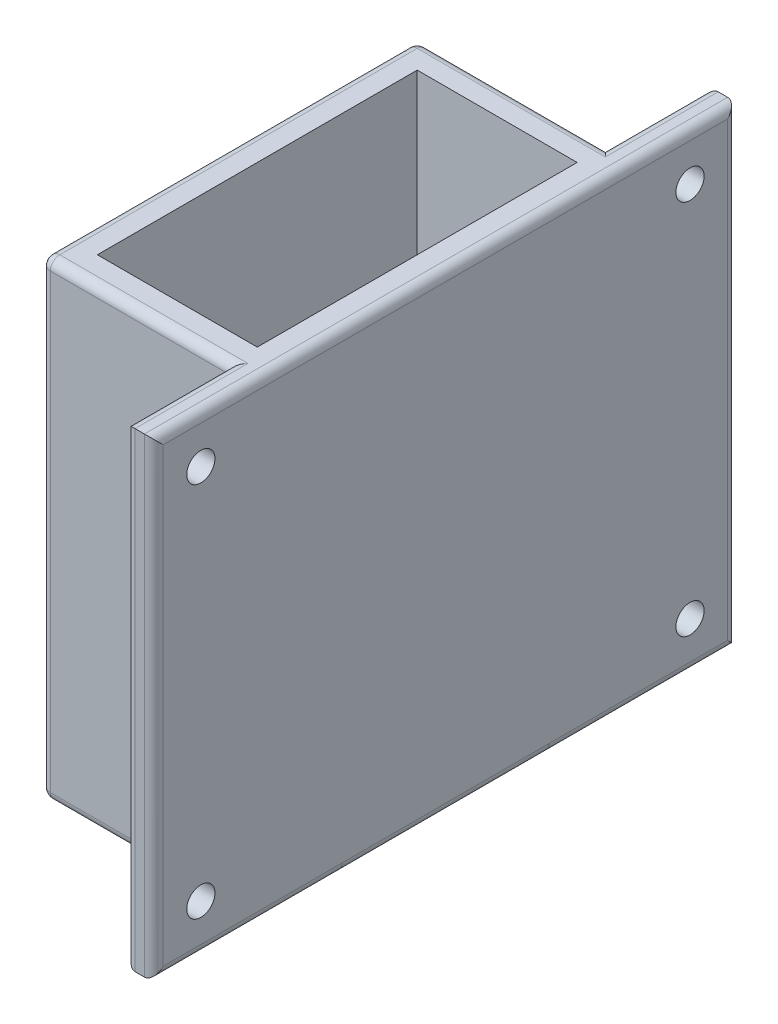
ISO-10303-21;
HEADER;
FILE_DESCRIPTION(('STEP AP214'),'2;1');
FILE_NAME('part.step','',(''),(''),'','','');
FILE_SCHEMA(('AUTOMOTIVE_DESIGN { 1 0 10303 214 1 1 1 1 }'));
ENDSEC;
DATA;
#1=APPLICATION_CONTEXT('core data for automotive mechanical design processes');
#2=APPLICATION_PROTOCOL_DEFINITION('international standard','automotive_design',2000,#1);
#3=PRODUCT_CONTEXT('',#1,'mechanical');
#4=PRODUCT('Part','Part','',(#3));
#5=PRODUCT_RELATED_PRODUCT_CATEGORY('part','',(#4));
#6=PRODUCT_DEFINITION_FORMATION('','',#4);
#7=PRODUCT_DEFINITION_CONTEXT('part definition',#1,'design');
#8=PRODUCT_DEFINITION('design','',#6,#7);
#9=PRODUCT_DEFINITION_SHAPE('','',#8);
#10=(LENGTH_UNIT() NAMED_UNIT(*) SI_UNIT(.MILLI.,.METRE.));
#11=(NAMED_UNIT(*) PLANE_ANGLE_UNIT() SI_UNIT($,.RADIAN.));
#12=(NAMED_UNIT(*) SI_UNIT($,.STERADIAN.) SOLID_ANGLE_UNIT());
#13=UNCERTAINTY_MEASURE_WITH_UNIT(LENGTH_MEASURE(1.E-05),#10,'distance_accuracy_value','');
#14=(GEOMETRIC_REPRESENTATION_CONTEXT(3) GLOBAL_UNCERTAINTY_ASSIGNED_CONTEXT((#13)) GLOBAL_UNIT_ASSIGNED_CONTEXT((#10,
#11,#12)) REPRESENTATION_CONTEXT('',''));
#15=CARTESIAN_POINT('',(0.,0.,0.));
#16=DIRECTION('',(0.,0.,1.));
#17=DIRECTION('',(1.,0.,0.));
#18=AXIS2_PLACEMENT_3D('',#15,#16,#17);
#19=CARTESIAN_POINT('',(0.,50.,-40.));
#20=DIRECTION('',(0.,0.,1.));
#21=DIRECTION('',(1.,0.,0.));
#22=AXIS2_PLACEMENT_3D('',#19,#20,#21);
#23=PLANE('',#22);
#24=DIRECTION('',(0.,-1.,0.));
#25=VECTOR('',#24,1.);
#26=CARTESIAN_POINT('',(-22.,50.,-40.));
#27=LINE('',#26,#25);
#28=CARTESIAN_POINT('',(-22.,1.,-40.));
#29=VERTEX_POINT('',#28);
#30=CARTESIAN_POINT('',(-22.,49.,-40.));
#31=VERTEX_POINT('',#30);
#32=EDGE_CURVE('E228',#29,#31,#27,.F.);
#33=ORIENTED_EDGE('',*,*,#32,.T.);
#34=DIRECTION('',(-1.,0.,0.));
#35=VECTOR('',#34,1.);
#36=CARTESIAN_POINT('',(-3.,49.,-40.));
#37=LINE('',#36,#35);
#38=CARTESIAN_POINT('',(-3.,49.,-40.));
#39=VERTEX_POINT('',#38);
#40=EDGE_CURVE('E215',#31,#39,#37,.F.);
#41=ORIENTED_EDGE('',*,*,#40,.T.);
#42=DIRECTION('',(0.,1.,0.));
#43=VECTOR('',#42,1.);
#44=CARTESIAN_POINT('',(-3.,50.,-40.));
#45=LINE('',#44,#43);
#46=CARTESIAN_POINT('',(-3.,1.,-40.));
#47=VERTEX_POINT('',#46);
#48=EDGE_CURVE('E199',#47,#39,#45,.T.);
#49=ORIENTED_EDGE('',*,*,#48,.F.);
#50=DIRECTION('',(-1.,0.,0.));
#51=VECTOR('',#50,1.);
#52=CARTESIAN_POINT('',(0.,1.,-40.));
#53=LINE('',#52,#51);
#54=EDGE_CURVE('E212',#47,#29,#53,.T.);
#55=ORIENTED_EDGE('',*,*,#54,.T.);
#56=EDGE_LOOP('',(#33,#41,#49,#55));
#57=FACE_BOUND('',#56,.T.);
#58=ADVANCED_FACE('F34',(#57),#23,.F.);
#59=CARTESIAN_POINT('',(0.,1.,-39.));
#60=DIRECTION('',(-1.,0.,0.));
#61=DIRECTION('',(0.,0.,1.));
#62=AXIS2_PLACEMENT_3D('',#59,#60,#61);
#63=CYLINDRICAL_SURFACE('',#62,1.);
#64=ORIENTED_EDGE('',*,*,#54,.F.);
#65=CARTESIAN_POINT('',(-2.,1.,-39.));
#66=DIRECTION('',(0.707106781186547,0.,-0.707106781186547));
#67=DIRECTION('',(-0.707106781186547,0.,-0.707106781186547));
#68=AXIS2_PLACEMENT_3D('',#65,#66,#67);
#69=ELLIPSE('',#68,1.41421356237309,1.);
#70=CARTESIAN_POINT('',(-2.,0.,-39.));
#71=VERTEX_POINT('',#70);
#72=EDGE_CURVE('E43',#47,#71,#69,.F.);
#73=ORIENTED_EDGE('',*,*,#72,.T.);
#74=DIRECTION('',(-1.,0.,0.));
#75=VECTOR('',#74,1.);
#76=CARTESIAN_POINT('',(0.,0.,-39.));
#77=LINE('',#76,#75);
#78=CARTESIAN_POINT('',(-22.,0.,-39.));
#79=VERTEX_POINT('',#78);
#80=EDGE_CURVE('E488',#79,#71,#77,.F.);
#81=ORIENTED_EDGE('',*,*,#80,.F.);
#82=CARTESIAN_POINT('',(-22.,1.,-39.));
#83=DIRECTION('',(-1.,0.,0.));
#84=DIRECTION('',(0.,0.,1.));
#85=AXIS2_PLACEMENT_3D('',#82,#83,#84);
#86=CIRCLE('',#85,1.);
#87=EDGE_CURVE('E226',#29,#79,#86,.T.);
#88=ORIENTED_EDGE('',*,*,#87,.F.);
#89=EDGE_LOOP('',(#64,#73,#81,#88));
#90=FACE_BOUND('',#89,.T.);
#91=ADVANCED_FACE('F222',(#90),#63,.T.);
#92=CARTESIAN_POINT('',(0.,50.,0.));
#93=DIRECTION('',(-1.,0.,0.));
#94=DIRECTION('',(0.,0.,1.));
#95=AXIS2_PLACEMENT_3D('',#92,#93,#94);
#96=PLANE('',#95);
#97=DIRECTION('',(0.,0.,-1.));
#98=VECTOR('',#97,1.);
#99=CARTESIAN_POINT('',(0.,1.,0.));
#100=LINE('',#99,#98);
#101=CARTESIAN_POINT('',(0.,1.,-9.00000000000001));
#102=VERTEX_POINT('',#101);
#103=CARTESIAN_POINT('',(0.,1.,-31.));
#104=VERTEX_POINT('',#103);
#105=EDGE_CURVE('E385',#102,#104,#100,.T.);
#106=ORIENTED_EDGE('',*,*,#105,.T.);
#107=DIRECTION('',(0.,0.,-1.));
#108=VECTOR('',#107,1.);
#109=CARTESIAN_POINT('',(0.,1.,0.));
#110=LINE('',#109,#108);
#111=CARTESIAN_POINT('',(0.,1.,-50.));
#112=VERTEX_POINT('',#111);
#113=EDGE_CURVE('E299',#104,#112,#110,.T.);
#114=ORIENTED_EDGE('',*,*,#113,.T.);
#115=DIRECTION('',(0.,1.,0.));
#116=VECTOR('',#115,1.);
#117=CARTESIAN_POINT('',(0.,50.,-50.));
#118=LINE('',#117,#116);
#119=CARTESIAN_POINT('',(0.,49.,-50.));
#120=VERTEX_POINT('',#119);
#121=EDGE_CURVE('E296',#112,#120,#118,.T.);
#122=ORIENTED_EDGE('',*,*,#121,.T.);
#123=DIRECTION('',(0.,0.,-1.));
#124=VECTOR('',#123,1.);
#125=CARTESIAN_POINT('',(0.,49.,11.));
#126=LINE('',#125,#124);
#127=CARTESIAN_POINT('',(0.,49.,10.));
#128=VERTEX_POINT('',#127);
#129=EDGE_CURVE('E301',#120,#128,#126,.F.);
#130=ORIENTED_EDGE('',*,*,#129,.T.);
#131=DIRECTION('',(0.,-1.,0.));
#132=VECTOR('',#131,1.);
#133=CARTESIAN_POINT('',(0.,0.,9.99999999999999));
#134=LINE('',#133,#132);
#135=CARTESIAN_POINT('',(0.,1.,9.99999999999999));
#136=VERTEX_POINT('',#135);
#137=EDGE_CURVE('E283',#128,#136,#134,.T.);
#138=ORIENTED_EDGE('',*,*,#137,.T.);
#139=DIRECTION('',(0.,0.,-1.));
#140=VECTOR('',#139,1.);
#141=CARTESIAN_POINT('',(0.,1.,0.));
#142=LINE('',#141,#140);
#143=EDGE_CURVE('E290',#136,#102,#142,.T.);
#144=ORIENTED_EDGE('',*,*,#143,.T.);
#145=EDGE_LOOP('',(#106,#114,#122,#130,#138,#144));
#146=FACE_BOUND('',#145,.T.);
#147=CARTESIAN_POINT('',(0.,5.,5.99999999999999));
#148=DIRECTION('',(1.,0.,0.));
#149=DIRECTION('',(0.,0.,-1.));
#150=AXIS2_PLACEMENT_3D('',#147,#148,#149);
#151=CIRCLE('',#150,1.5);
#152=CARTESIAN_POINT('',(0.,5.,4.5));
#153=VERTEX_POINT('',#152);
#154=EDGE_CURVE('E216',#153,#153,#151,.T.);
#155=ORIENTED_EDGE('',*,*,#154,.F.);
#156=EDGE_LOOP('',(#155));
#157=FACE_BOUND('',#156,.T.);
#158=CARTESIAN_POINT('',(0.,45.,6.));
#159=DIRECTION('',(1.,0.,0.));
#160=DIRECTION('',(0.,0.,-1.));
#161=AXIS2_PLACEMENT_3D('',#158,#159,#160);
#162=CIRCLE('',#161,1.5);
#163=CARTESIAN_POINT('',(0.,45.,4.5));
#164=VERTEX_POINT('',#163);
#165=EDGE_CURVE('E930',#164,#164,#162,.T.);
#166=ORIENTED_EDGE('',*,*,#165,.F.);
#167=EDGE_LOOP('',(#166));
#168=FACE_BOUND('',#167,.T.);
#169=CARTESIAN_POINT('',(0.,5.,-46.));
#170=DIRECTION('',(1.,0.,0.));
#171=DIRECTION('',(0.,0.,-1.));
#172=AXIS2_PLACEMENT_3D('',#169,#170,#171);
#173=CIRCLE('',#172,1.5);
#174=CARTESIAN_POINT('',(0.,5.,-47.5));
#175=VERTEX_POINT('',#174);
#176=EDGE_CURVE('E924',#175,#175,#173,.T.);
#177=ORIENTED_EDGE('',*,*,#176,.F.);
#178=EDGE_LOOP('',(#177));
#179=FACE_BOUND('',#178,.T.);
#180=CARTESIAN_POINT('',(0.,45.,-46.));
#181=DIRECTION('',(1.,0.,0.));
#182=DIRECTION('',(0.,0.,-1.));
#183=AXIS2_PLACEMENT_3D('',#180,#181,#182);
#184=CIRCLE('',#183,1.5);
#185=CARTESIAN_POINT('',(0.,45.,-47.5));
#186=VERTEX_POINT('',#185);
#187=EDGE_CURVE('E266',#186,#186,#184,.T.);
#188=ORIENTED_EDGE('',*,*,#187,.F.);
#189=EDGE_LOOP('',(#188));
#190=FACE_BOUND('',#189,.T.);
#191=ADVANCED_FACE('F358',(#146,#157,#168,#179,#190),#96,.F.);
#192=CARTESIAN_POINT('',(-23.,50.,0.));
#193=DIRECTION('',(1.,0.,0.));
#194=DIRECTION('',(0.,0.,-1.));
#195=AXIS2_PLACEMENT_3D('',#192,#193,#194);
#196=PLANE('',#195);
#197=DIRECTION('',(0.,-1.,0.));
#198=VECTOR('',#197,1.);
#199=CARTESIAN_POINT('',(-23.,50.,-0.999999999999997));
#200=LINE('',#199,#198);
#201=CARTESIAN_POINT('',(-23.,1.,-0.999999999999997));
#202=VERTEX_POINT('',#201);
#203=CARTESIAN_POINT('',(-23.,49.,-0.999999999999997));
#204=VERTEX_POINT('',#203);
#205=EDGE_CURVE('E470',#202,#204,#200,.F.);
#206=ORIENTED_EDGE('',*,*,#205,.T.);
#207=DIRECTION('',(0.,0.,1.));
#208=VECTOR('',#207,1.);
#209=CARTESIAN_POINT('',(-23.,49.,-39.));
#210=LINE('',#209,#208);
#211=CARTESIAN_POINT('',(-23.,49.,-39.));
#212=VERTEX_POINT('',#211);
#213=EDGE_CURVE('E341',#204,#212,#210,.F.);
#214=ORIENTED_EDGE('',*,*,#213,.T.);
#215=DIRECTION('',(0.,-1.,0.));
#216=VECTOR('',#215,1.);
#217=CARTESIAN_POINT('',(-23.,50.,-39.));
#218=LINE('',#217,#216);
#219=CARTESIAN_POINT('',(-23.,1.,-39.));
#220=VERTEX_POINT('',#219);
#221=EDGE_CURVE('E483',#212,#220,#218,.T.);
#222=ORIENTED_EDGE('',*,*,#221,.T.);
#223=DIRECTION('',(0.,0.,1.));
#224=VECTOR('',#223,1.);
#225=CARTESIAN_POINT('',(-23.,1.,0.));
#226=LINE('',#225,#224);
#227=EDGE_CURVE('E480',#220,#202,#226,.T.);
#228=ORIENTED_EDGE('',*,*,#227,.T.);
#229=EDGE_LOOP('',(#206,#214,#222,#228));
#230=FACE_BOUND('',#229,.T.);
#231=ADVANCED_FACE('F518',(#230),#196,.F.);
#232=CARTESIAN_POINT('',(0.,50.,0.));
#233=DIRECTION('',(0.,0.,-1.));
#234=DIRECTION('',(-1.,0.,0.));
#235=AXIS2_PLACEMENT_3D('',#232,#233,#234);
#236=PLANE('',#235);
#237=DIRECTION('',(0.,1.,0.));
#238=VECTOR('',#237,1.);
#239=CARTESIAN_POINT('',(-3.,50.,0.));
#240=LINE('',#239,#238);
#241=CARTESIAN_POINT('',(-3.,1.,0.));
#242=VERTEX_POINT('',#241);
#243=CARTESIAN_POINT('',(-3.,49.,0.));
#244=VERTEX_POINT('',#243);
#245=EDGE_CURVE('E422',#242,#244,#240,.T.);
#246=ORIENTED_EDGE('',*,*,#245,.T.);
#247=DIRECTION('',(1.,0.,0.));
#248=VECTOR('',#247,1.);
#249=CARTESIAN_POINT('',(-22.,49.,0.));
#250=LINE('',#249,#248);
#251=CARTESIAN_POINT('',(-22.,49.,0.));
#252=VERTEX_POINT('',#251);
#253=EDGE_CURVE('E331',#244,#252,#250,.F.);
#254=ORIENTED_EDGE('',*,*,#253,.T.);
#255=DIRECTION('',(0.,-1.,0.));
#256=VECTOR('',#255,1.);
#257=CARTESIAN_POINT('',(-22.,50.,0.));
#258=LINE('',#257,#256);
#259=CARTESIAN_POINT('',(-22.,1.,0.));
#260=VERTEX_POINT('',#259);
#261=EDGE_CURVE('E438',#252,#260,#258,.T.);
#262=ORIENTED_EDGE('',*,*,#261,.T.);
#263=DIRECTION('',(1.,0.,0.));
#264=VECTOR('',#263,1.);
#265=CARTESIAN_POINT('',(0.,1.,0.));
#266=LINE('',#265,#264);
#267=EDGE_CURVE('E431',#260,#242,#266,.T.);
#268=ORIENTED_EDGE('',*,*,#267,.T.);
#269=EDGE_LOOP('',(#246,#254,#262,#268));
#270=FACE_BOUND('',#269,.T.);
#271=ADVANCED_FACE('F436',(#270),#236,.F.);
#272=CARTESIAN_POINT('',(0.,50.,0.));
#273=DIRECTION('',(0.,1.,0.));
#274=DIRECTION('',(0.,0.,1.));
#275=AXIS2_PLACEMENT_3D('',#272,#273,#274);
#276=PLANE('',#275);
#277=DIRECTION('',(1.,0.,0.));
#278=VECTOR('',#277,1.);
#279=CARTESIAN_POINT('',(-3.,50.,11.));
#280=LINE('',#279,#278);
#281=CARTESIAN_POINT('',(-2.,50.,11.));
#282=VERTEX_POINT('',#281);
#283=CARTESIAN_POINT('',(-1.,50.,11.));
#284=VERTEX_POINT('',#283);
#285=EDGE_CURVE('E314',#282,#284,#280,.T.);
#286=ORIENTED_EDGE('',*,*,#285,.T.);
#287=DIRECTION('',(0.,0.,-1.));
#288=VECTOR('',#287,1.);
#289=CARTESIAN_POINT('',(-1.,50.,-51.));
#290=LINE('',#289,#288);
#291=CARTESIAN_POINT('',(-1.,50.,-51.));
#292=VERTEX_POINT('',#291);
#293=EDGE_CURVE('E322',#284,#292,#290,.T.);
#294=ORIENTED_EDGE('',*,*,#293,.T.);
#295=DIRECTION('',(1.,0.,0.));
#296=VECTOR('',#295,1.);
#297=CARTESIAN_POINT('',(-3.,50.,-51.));
#298=LINE('',#297,#296);
#299=CARTESIAN_POINT('',(-2.,50.,-51.));
#300=VERTEX_POINT('',#299);
#301=EDGE_CURVE('E217',#300,#292,#298,.T.);
#302=ORIENTED_EDGE('',*,*,#301,.F.);
#303=DIRECTION('',(0.,0.,1.));
#304=VECTOR('',#303,1.);
#305=CARTESIAN_POINT('',(-2.,50.,-40.));
#306=LINE('',#305,#304);
#307=CARTESIAN_POINT('',(-2.,50.,-39.));
#308=VERTEX_POINT('',#307);
#309=EDGE_CURVE('E332',#300,#308,#306,.T.);
#310=ORIENTED_EDGE('',*,*,#309,.T.);
#311=DIRECTION('',(-1.,0.,0.));
#312=VECTOR('',#311,1.);
#313=CARTESIAN_POINT('',(-22.,50.,-39.));
#314=LINE('',#313,#312);
#315=CARTESIAN_POINT('',(-22.,50.,-39.));
#316=VERTEX_POINT('',#315);
#317=EDGE_CURVE('E336',#308,#316,#314,.T.);
#318=ORIENTED_EDGE('',*,*,#317,.T.);
#319=DIRECTION('',(0.,0.,1.));
#320=VECTOR('',#319,1.);
#321=CARTESIAN_POINT('',(-22.,50.,-0.999999999999997));
#322=LINE('',#321,#320);
#323=CARTESIAN_POINT('',(-22.,50.,-0.999999999999997));
#324=VERTEX_POINT('',#323);
#325=EDGE_CURVE('E390',#316,#324,#322,.T.);
#326=ORIENTED_EDGE('',*,*,#325,.T.);
#327=DIRECTION('',(1.,0.,0.));
#328=VECTOR('',#327,1.);
#329=CARTESIAN_POINT('',(-3.,50.,-1.));
#330=LINE('',#329,#328);
#331=CARTESIAN_POINT('',(-2.,50.,-1.));
#332=VERTEX_POINT('',#331);
#333=EDGE_CURVE('E383',#324,#332,#330,.T.);
#334=ORIENTED_EDGE('',*,*,#333,.T.);
#335=DIRECTION('',(0.,0.,1.));
#336=VECTOR('',#335,1.);
#337=CARTESIAN_POINT('',(-2.,50.,0.));
#338=LINE('',#337,#336);
#339=EDGE_CURVE('E326',#332,#282,#338,.T.);
#340=ORIENTED_EDGE('',*,*,#339,.T.);
#341=EDGE_LOOP('',(#286,#294,#302,#310,#318,#326,#334,#340));
#342=FACE_BOUND('',#341,.T.);
#343=DIRECTION('',(-1.,0.,0.));
#344=VECTOR('',#343,1.);
#345=CARTESIAN_POINT('',(-20.,50.,-37.));
#346=LINE('',#345,#344);
#347=CARTESIAN_POINT('',(-3.,50.,-37.));
#348=VERTEX_POINT('',#347);
#349=CARTESIAN_POINT('',(-20.,50.,-37.));
#350=VERTEX_POINT('',#349);
#351=EDGE_CURVE('E450',#348,#350,#346,.T.);
#352=ORIENTED_EDGE('',*,*,#351,.F.);
#353=DIRECTION('',(0.,0.,-1.));
#354=VECTOR('',#353,1.);
#355=CARTESIAN_POINT('',(-3.,50.,-37.));
#356=LINE('',#355,#354);
#357=CARTESIAN_POINT('',(-3.,50.,-3.));
#358=VERTEX_POINT('',#357);
#359=EDGE_CURVE('E464',#358,#348,#356,.T.);
#360=ORIENTED_EDGE('',*,*,#359,.F.);
#361=DIRECTION('',(1.,0.,0.));
#362=VECTOR('',#361,1.);
#363=CARTESIAN_POINT('',(-20.,50.,-3.));
#364=LINE('',#363,#362);
#365=CARTESIAN_POINT('',(-20.,50.,-3.));
#366=VERTEX_POINT('',#365);
#367=EDGE_CURVE('E461',#366,#358,#364,.T.);
#368=ORIENTED_EDGE('',*,*,#367,.F.);
#369=DIRECTION('',(0.,0.,1.));
#370=VECTOR('',#369,1.);
#371=CARTESIAN_POINT('',(-20.,50.,-37.));
#372=LINE('',#371,#370);
#373=EDGE_CURVE('E459',#350,#366,#372,.T.);
#374=ORIENTED_EDGE('',*,*,#373,.F.);
#375=EDGE_LOOP('',(#352,#360,#368,#374));
#376=FACE_BOUND('',#375,.T.);
#377=ADVANCED_FACE('F319',(#342,#376),#276,.T.);
#378=CARTESIAN_POINT('',(0.,0.,0.));
#379=DIRECTION('',(0.,1.,0.));
#380=DIRECTION('',(0.,0.,1.));
#381=AXIS2_PLACEMENT_3D('',#378,#379,#380);
#382=PLANE('',#381);
#383=ORIENTED_EDGE('',*,*,#80,.T.);
#384=DIRECTION('',(0.,0.,-1.));
#385=VECTOR('',#384,1.);
#386=CARTESIAN_POINT('',(-2.,0.,0.));
#387=LINE('',#386,#385);
#388=CARTESIAN_POINT('',(-2.,0.,-51.));
#389=VERTEX_POINT('',#388);
#390=EDGE_CURVE('E232',#71,#389,#387,.T.);
#391=ORIENTED_EDGE('',*,*,#390,.T.);
#392=DIRECTION('',(1.,0.,0.));
#393=VECTOR('',#392,1.);
#394=CARTESIAN_POINT('',(-3.,0.,-51.));
#395=LINE('',#394,#393);
#396=CARTESIAN_POINT('',(-1.,0.,-51.));
#397=VERTEX_POINT('',#396);
#398=EDGE_CURVE('E370',#389,#397,#395,.T.);
#399=ORIENTED_EDGE('',*,*,#398,.T.);
#400=DIRECTION('',(0.,0.,-1.));
#401=VECTOR('',#400,1.);
#402=CARTESIAN_POINT('',(-1.,0.,0.));
#403=LINE('',#402,#401);
#404=CARTESIAN_POINT('',(-1.,0.,-31.));
#405=VERTEX_POINT('',#404);
#406=EDGE_CURVE('E350',#397,#405,#403,.F.);
#407=ORIENTED_EDGE('',*,*,#406,.T.);
#408=DIRECTION('',(0.,0.,-1.));
#409=VECTOR('',#408,1.);
#410=CARTESIAN_POINT('',(-1.,0.,0.));
#411=LINE('',#410,#409);
#412=CARTESIAN_POINT('',(-1.,0.,-9.00000000000001));
#413=VERTEX_POINT('',#412);
#414=EDGE_CURVE('E485',#405,#413,#411,.F.);
#415=ORIENTED_EDGE('',*,*,#414,.T.);
#416=DIRECTION('',(0.,0.,-1.));
#417=VECTOR('',#416,1.);
#418=CARTESIAN_POINT('',(-1.,0.,0.));
#419=LINE('',#418,#417);
#420=CARTESIAN_POINT('',(-1.,0.,11.));
#421=VERTEX_POINT('',#420);
#422=EDGE_CURVE('E289',#413,#421,#419,.F.);
#423=ORIENTED_EDGE('',*,*,#422,.T.);
#424=DIRECTION('',(1.,0.,0.));
#425=VECTOR('',#424,1.);
#426=CARTESIAN_POINT('',(-3.,0.,11.));
#427=LINE('',#426,#425);
#428=CARTESIAN_POINT('',(-2.,0.,11.));
#429=VERTEX_POINT('',#428);
#430=EDGE_CURVE('E317',#429,#421,#427,.T.);
#431=ORIENTED_EDGE('',*,*,#430,.F.);
#432=DIRECTION('',(0.,0.,-1.));
#433=VECTOR('',#432,1.);
#434=CARTESIAN_POINT('',(-2.,0.,-1.));
#435=LINE('',#434,#433);
#436=CARTESIAN_POINT('',(-2.,0.,-1.));
#437=VERTEX_POINT('',#436);
#438=EDGE_CURVE('E346',#429,#437,#435,.T.);
#439=ORIENTED_EDGE('',*,*,#438,.T.);
#440=DIRECTION('',(1.,0.,0.));
#441=VECTOR('',#440,1.);
#442=CARTESIAN_POINT('',(0.,0.,-1.));
#443=LINE('',#442,#441);
#444=CARTESIAN_POINT('',(-22.,0.,-0.999999999999997));
#445=VERTEX_POINT('',#444);
#446=EDGE_CURVE('E433',#437,#445,#443,.F.);
#447=ORIENTED_EDGE('',*,*,#446,.T.);
#448=DIRECTION('',(0.,0.,1.));
#449=VECTOR('',#448,1.);
#450=CARTESIAN_POINT('',(-22.,0.,0.));
#451=LINE('',#450,#449);
#452=EDGE_CURVE('E229',#445,#79,#451,.F.);
#453=ORIENTED_EDGE('',*,*,#452,.T.);
#454=EDGE_LOOP('',(#383,#391,#399,#407,#415,#423,#431,#439,#447,#453));
#455=FACE_BOUND('',#454,.T.);
#456=ADVANCED_FACE('F373',(#455),#382,.F.);
#457=CARTESIAN_POINT('',(-20.,5.,-37.));
#458=DIRECTION('',(-1.,0.,0.));
#459=DIRECTION('',(0.,0.,1.));
#460=AXIS2_PLACEMENT_3D('',#457,#458,#459);
#461=PLANE('',#460);
#462=ORIENTED_EDGE('',*,*,#373,.T.);
#463=DIRECTION('',(0.,1.,0.));
#464=VECTOR('',#463,1.);
#465=CARTESIAN_POINT('',(-20.,5.,-3.));
#466=LINE('',#465,#464);
#467=CARTESIAN_POINT('',(-20.,5.,-3.));
#468=VERTEX_POINT('',#467);
#469=EDGE_CURVE('E458',#468,#366,#466,.T.);
#470=ORIENTED_EDGE('',*,*,#469,.F.);
#471=DIRECTION('',(0.,0.,1.));
#472=VECTOR('',#471,1.);
#473=CARTESIAN_POINT('',(-20.,5.,-37.));
#474=LINE('',#473,#472);
#475=CARTESIAN_POINT('',(-20.,5.,-37.));
#476=VERTEX_POINT('',#475);
#477=EDGE_CURVE('E446',#476,#468,#474,.T.);
#478=ORIENTED_EDGE('',*,*,#477,.F.);
#479=DIRECTION('',(0.,1.,0.));
#480=VECTOR('',#479,1.);
#481=CARTESIAN_POINT('',(-20.,5.,-37.));
#482=LINE('',#481,#480);
#483=EDGE_CURVE('E468',#476,#350,#482,.T.);
#484=ORIENTED_EDGE('',*,*,#483,.T.);
#485=EDGE_LOOP('',(#462,#470,#478,#484));
#486=FACE_BOUND('',#485,.T.);
#487=ADVANCED_FACE('F785',(#486),#461,.F.);
#488=CARTESIAN_POINT('',(-20.,5.,-37.));
#489=DIRECTION('',(0.,0.,-1.));
#490=DIRECTION('',(-1.,0.,0.));
#491=AXIS2_PLACEMENT_3D('',#488,#489,#490);
#492=PLANE('',#491);
#493=ORIENTED_EDGE('',*,*,#351,.T.);
#494=ORIENTED_EDGE('',*,*,#483,.F.);
#495=DIRECTION('',(-1.,0.,0.));
#496=VECTOR('',#495,1.);
#497=CARTESIAN_POINT('',(-20.,5.,-37.));
#498=LINE('',#497,#496);
#499=CARTESIAN_POINT('',(-3.,5.,-37.));
#500=VERTEX_POINT('',#499);
#501=EDGE_CURVE('E455',#500,#476,#498,.T.);
#502=ORIENTED_EDGE('',*,*,#501,.F.);
#503=DIRECTION('',(0.,1.,0.));
#504=VECTOR('',#503,1.);
#505=CARTESIAN_POINT('',(-3.,5.,-37.));
#506=LINE('',#505,#504);
#507=EDGE_CURVE('E471',#500,#348,#506,.T.);
#508=ORIENTED_EDGE('',*,*,#507,.T.);
#509=EDGE_LOOP('',(#493,#494,#502,#508));
#510=FACE_BOUND('',#509,.T.);
#511=ADVANCED_FACE('F863',(#510),#492,.F.);
#512=CARTESIAN_POINT('',(-3.,5.,-37.));
#513=DIRECTION('',(1.,0.,0.));
#514=DIRECTION('',(0.,0.,-1.));
#515=AXIS2_PLACEMENT_3D('',#512,#513,#514);
#516=PLANE('',#515);
#517=ORIENTED_EDGE('',*,*,#359,.T.);
#518=ORIENTED_EDGE('',*,*,#507,.F.);
#519=DIRECTION('',(0.,0.,-1.));
#520=VECTOR('',#519,1.);
#521=CARTESIAN_POINT('',(-3.,5.,-37.));
#522=LINE('',#521,#520);
#523=CARTESIAN_POINT('',(-3.,5.,-3.));
#524=VERTEX_POINT('',#523);
#525=EDGE_CURVE('E453',#524,#500,#522,.T.);
#526=ORIENTED_EDGE('',*,*,#525,.F.);
#527=DIRECTION('',(0.,1.,0.));
#528=VECTOR('',#527,1.);
#529=CARTESIAN_POINT('',(-3.,5.,-3.));
#530=LINE('',#529,#528);
#531=EDGE_CURVE('E474',#524,#358,#530,.T.);
#532=ORIENTED_EDGE('',*,*,#531,.T.);
#533=EDGE_LOOP('',(#517,#518,#526,#532));
#534=FACE_BOUND('',#533,.T.);
#535=ADVANCED_FACE('F872',(#534),#516,.F.);
#536=CARTESIAN_POINT('',(-20.,5.,-3.));
#537=DIRECTION('',(0.,0.,1.));
#538=DIRECTION('',(1.,0.,0.));
#539=AXIS2_PLACEMENT_3D('',#536,#537,#538);
#540=PLANE('',#539);
#541=ORIENTED_EDGE('',*,*,#367,.T.);
#542=ORIENTED_EDGE('',*,*,#531,.F.);
#543=DIRECTION('',(1.,0.,0.));
#544=VECTOR('',#543,1.);
#545=CARTESIAN_POINT('',(-20.,5.,-3.));
#546=LINE('',#545,#544);
#547=EDGE_CURVE('E449',#468,#524,#546,.T.);
#548=ORIENTED_EDGE('',*,*,#547,.F.);
#549=ORIENTED_EDGE('',*,*,#469,.T.);
#550=EDGE_LOOP('',(#541,#542,#548,#549));
#551=FACE_BOUND('',#550,.T.);
#552=ADVANCED_FACE('F880',(#551),#540,.F.);
#553=CARTESIAN_POINT('',(0.,5.,0.));
#554=DIRECTION('',(0.,1.,0.));
#555=DIRECTION('',(0.,0.,1.));
#556=AXIS2_PLACEMENT_3D('',#553,#554,#555);
#557=PLANE('',#556);
#558=ORIENTED_EDGE('',*,*,#477,.T.);
#559=ORIENTED_EDGE('',*,*,#547,.T.);
#560=ORIENTED_EDGE('',*,*,#525,.T.);
#561=ORIENTED_EDGE('',*,*,#501,.T.);
#562=EDGE_LOOP('',(#558,#559,#560,#561));
#563=FACE_BOUND('',#562,.T.);
#564=ADVANCED_FACE('F530',(#563),#557,.T.);
#565=CARTESIAN_POINT('',(-1.,1.,0.));
#566=DIRECTION('',(0.,0.,-1.));
#567=DIRECTION('',(-1.,0.,0.));
#568=AXIS2_PLACEMENT_3D('',#565,#566,#567);
#569=CYLINDRICAL_SURFACE('',#568,1.);
#570=CARTESIAN_POINT('',(-1.,1.,-31.));
#571=DIRECTION('',(0.,0.,1.));
#572=DIRECTION('',(0.,-1.,0.));
#573=AXIS2_PLACEMENT_3D('',#570,#571,#572);
#574=CIRCLE('',#573,1.);
#575=EDGE_CURVE('E380',#104,#405,#574,.F.);
#576=ORIENTED_EDGE('',*,*,#575,.F.);
#577=ORIENTED_EDGE('',*,*,#105,.F.);
#578=CARTESIAN_POINT('',(-1.,1.,-9.00000000000001));
#579=DIRECTION('',(0.,0.,-1.));
#580=DIRECTION('',(0.,1.,0.));
#581=AXIS2_PLACEMENT_3D('',#578,#579,#580);
#582=CIRCLE('',#581,1.);
#583=EDGE_CURVE('E292',#413,#102,#582,.F.);
#584=ORIENTED_EDGE('',*,*,#583,.F.);
#585=ORIENTED_EDGE('',*,*,#414,.F.);
#586=EDGE_LOOP('',(#576,#577,#584,#585));
#587=FACE_BOUND('',#586,.T.);
#588=ADVANCED_FACE('F523',(#587),#569,.T.);
#589=CARTESIAN_POINT('',(-22.,50.,-39.));
#590=DIRECTION('',(0.,-1.,0.));
#591=DIRECTION('',(0.,0.,-1.));
#592=AXIS2_PLACEMENT_3D('',#589,#590,#591);
#593=CYLINDRICAL_SURFACE('',#592,1.);
#594=ORIENTED_EDGE('',*,*,#221,.F.);
#595=CARTESIAN_POINT('',(-22.,49.,-39.));
#596=DIRECTION('',(0.,-1.,0.));
#597=DIRECTION('',(0.,0.,-1.));
#598=AXIS2_PLACEMENT_3D('',#595,#596,#597);
#599=CIRCLE('',#598,1.);
#600=EDGE_CURVE('E343',#212,#31,#599,.T.);
#601=ORIENTED_EDGE('',*,*,#600,.T.);
#602=ORIENTED_EDGE('',*,*,#32,.F.);
#603=CARTESIAN_POINT('',(-22.,1.,-39.));
#604=DIRECTION('',(0.,-1.,0.));
#605=DIRECTION('',(0.,0.,-1.));
#606=AXIS2_PLACEMENT_3D('',#603,#604,#605);
#607=CIRCLE('',#606,1.);
#608=EDGE_CURVE('E502',#220,#29,#607,.T.);
#609=ORIENTED_EDGE('',*,*,#608,.F.);
#610=EDGE_LOOP('',(#594,#601,#602,#609));
#611=FACE_BOUND('',#610,.T.);
#612=ADVANCED_FACE('F521',(#611),#593,.T.);
#613=CARTESIAN_POINT('',(-22.,50.,-0.999999999999997));
#614=DIRECTION('',(0.,-1.,0.));
#615=DIRECTION('',(0.,0.,-1.));
#616=AXIS2_PLACEMENT_3D('',#613,#614,#615);
#617=CYLINDRICAL_SURFACE('',#616,1.);
#618=ORIENTED_EDGE('',*,*,#261,.F.);
#619=CARTESIAN_POINT('',(-22.,49.,-0.999999999999997));
#620=DIRECTION('',(0.,-1.,0.));
#621=DIRECTION('',(0.,0.,-1.));
#622=AXIS2_PLACEMENT_3D('',#619,#620,#621);
#623=CIRCLE('',#622,1.);
#624=EDGE_CURVE('E334',#252,#204,#623,.T.);
#625=ORIENTED_EDGE('',*,*,#624,.T.);
#626=ORIENTED_EDGE('',*,*,#205,.F.);
#627=CARTESIAN_POINT('',(-22.,1.,-0.999999999999997));
#628=DIRECTION('',(0.,-1.,0.));
#629=DIRECTION('',(0.,0.,-1.));
#630=AXIS2_PLACEMENT_3D('',#627,#628,#629);
#631=CIRCLE('',#630,1.);
#632=EDGE_CURVE('E499',#260,#202,#631,.T.);
#633=ORIENTED_EDGE('',*,*,#632,.F.);
#634=EDGE_LOOP('',(#618,#625,#626,#633));
#635=FACE_BOUND('',#634,.T.);
#636=ADVANCED_FACE('F516',(#635),#617,.T.);
#637=CARTESIAN_POINT('',(0.,1.,-1.));
#638=DIRECTION('',(1.,0.,0.));
#639=DIRECTION('',(0.,0.,-1.));
#640=AXIS2_PLACEMENT_3D('',#637,#638,#639);
#641=CYLINDRICAL_SURFACE('',#640,1.);
#642=ORIENTED_EDGE('',*,*,#446,.F.);
#643=CARTESIAN_POINT('',(-2.,1.,-1.));
#644=DIRECTION('',(0.707106781186548,0.,0.707106781186547));
#645=DIRECTION('',(-0.707106781186547,0.,0.707106781186548));
#646=AXIS2_PLACEMENT_3D('',#643,#644,#645);
#647=ELLIPSE('',#646,1.4142135623731,1.);
#648=EDGE_CURVE('E11',#437,#242,#647,.F.);
#649=ORIENTED_EDGE('',*,*,#648,.T.);
#650=ORIENTED_EDGE('',*,*,#267,.F.);
#651=CARTESIAN_POINT('',(-22.,1.,-0.999999999999997));
#652=DIRECTION('',(-1.,0.,0.));
#653=DIRECTION('',(0.,0.,1.));
#654=AXIS2_PLACEMENT_3D('',#651,#652,#653);
#655=CIRCLE('',#654,1.);
#656=EDGE_CURVE('E496',#445,#260,#655,.T.);
#657=ORIENTED_EDGE('',*,*,#656,.F.);
#658=EDGE_LOOP('',(#642,#649,#650,#657));
#659=FACE_BOUND('',#658,.T.);
#660=ADVANCED_FACE('F429',(#659),#641,.T.);
#661=CARTESIAN_POINT('',(-22.,1.,-39.));
#662=DIRECTION('',(0.,0.,1.));
#663=DIRECTION('',(1.,0.,0.));
#664=AXIS2_PLACEMENT_3D('',#661,#662,#663);
#665=SPHERICAL_SURFACE('',#664,1.);
#666=ORIENTED_EDGE('',*,*,#608,.T.);
#667=ORIENTED_EDGE('',*,*,#87,.T.);
#668=CARTESIAN_POINT('',(-22.,1.,-39.));
#669=DIRECTION('',(0.,0.,-1.));
#670=DIRECTION('',(-1.,0.,0.));
#671=AXIS2_PLACEMENT_3D('',#668,#669,#670);
#672=CIRCLE('',#671,1.);
#673=EDGE_CURVE('E443',#220,#79,#672,.F.);
#674=ORIENTED_EDGE('',*,*,#673,.F.);
#675=EDGE_LOOP('',(#666,#667,#674));
#676=FACE_BOUND('',#675,.T.);
#677=ADVANCED_FACE('F505',(#676),#665,.T.);
#678=CARTESIAN_POINT('',(-22.,1.,-0.999999999999997));
#679=DIRECTION('',(0.,0.,1.));
#680=DIRECTION('',(1.,0.,0.));
#681=AXIS2_PLACEMENT_3D('',#678,#679,#680);
#682=SPHERICAL_SURFACE('',#681,1.);
#683=ORIENTED_EDGE('',*,*,#656,.T.);
#684=ORIENTED_EDGE('',*,*,#632,.T.);
#685=CARTESIAN_POINT('',(-22.,1.,-0.999999999999997));
#686=DIRECTION('',(0.,0.,1.));
#687=DIRECTION('',(1.,0.,0.));
#688=AXIS2_PLACEMENT_3D('',#685,#686,#687);
#689=CIRCLE('',#688,1.);
#690=EDGE_CURVE('E441',#445,#202,#689,.F.);
#691=ORIENTED_EDGE('',*,*,#690,.F.);
#692=EDGE_LOOP('',(#683,#684,#691));
#693=FACE_BOUND('',#692,.T.);
#694=ADVANCED_FACE('F513',(#693),#682,.T.);
#695=CARTESIAN_POINT('',(-22.,1.,0.));
#696=DIRECTION('',(0.,0.,1.));
#697=DIRECTION('',(1.,0.,0.));
#698=AXIS2_PLACEMENT_3D('',#695,#696,#697);
#699=CYLINDRICAL_SURFACE('',#698,1.);
#700=ORIENTED_EDGE('',*,*,#673,.T.);
#701=ORIENTED_EDGE('',*,*,#452,.F.);
#702=ORIENTED_EDGE('',*,*,#690,.T.);
#703=ORIENTED_EDGE('',*,*,#227,.F.);
#704=EDGE_LOOP('',(#700,#701,#702,#703));
#705=FACE_BOUND('',#704,.T.);
#706=ADVANCED_FACE('F511',(#705),#699,.T.);
#707=CARTESIAN_POINT('',(-3.,0.,0.));
#708=DIRECTION('',(-1.,0.,0.));
#709=DIRECTION('',(0.,0.,1.));
#710=AXIS2_PLACEMENT_3D('',#707,#708,#709);
#711=PLANE('',#710);
#712=CARTESIAN_POINT('',(-3.,45.,6.));
#713=DIRECTION('',(1.,0.,0.));
#714=DIRECTION('',(0.,0.,-1.));
#715=AXIS2_PLACEMENT_3D('',#712,#713,#714);
#716=CIRCLE('',#715,1.5);
#717=CARTESIAN_POINT('',(-3.,45.,4.5));
#718=VERTEX_POINT('',#717);
#719=EDGE_CURVE('E327',#718,#718,#716,.T.);
#720=ORIENTED_EDGE('',*,*,#719,.T.);
#721=EDGE_LOOP('',(#720));
#722=FACE_BOUND('',#721,.T.);
#723=CARTESIAN_POINT('',(-3.,5.,5.99999999999999));
#724=DIRECTION('',(1.,0.,0.));
#725=DIRECTION('',(0.,0.,-1.));
#726=AXIS2_PLACEMENT_3D('',#723,#724,#725);
#727=CIRCLE('',#726,1.5);
#728=CARTESIAN_POINT('',(-3.,5.,4.5));
#729=VERTEX_POINT('',#728);
#730=EDGE_CURVE('E927',#729,#729,#727,.T.);
#731=ORIENTED_EDGE('',*,*,#730,.T.);
#732=EDGE_LOOP('',(#731));
#733=FACE_BOUND('',#732,.T.);
#734=DIRECTION('',(0.,-1.,0.));
#735=VECTOR('',#734,1.);
#736=CARTESIAN_POINT('',(-3.,0.,9.99999999999999));
#737=LINE('',#736,#735);
#738=CARTESIAN_POINT('',(-3.,1.,9.99999999999999));
#739=VERTEX_POINT('',#738);
#740=CARTESIAN_POINT('',(-3.,49.,10.));
#741=VERTEX_POINT('',#740);
#742=EDGE_CURVE('E51',#739,#741,#737,.F.);
#743=ORIENTED_EDGE('',*,*,#742,.T.);
#744=DIRECTION('',(0.,0.,1.));
#745=VECTOR('',#744,1.);
#746=CARTESIAN_POINT('',(-3.,49.,0.));
#747=LINE('',#746,#745);
#748=EDGE_CURVE('E233',#741,#244,#747,.F.);
#749=ORIENTED_EDGE('',*,*,#748,.T.);
#750=ORIENTED_EDGE('',*,*,#245,.F.);
#751=DIRECTION('',(0.,0.,-1.));
#752=VECTOR('',#751,1.);
#753=CARTESIAN_POINT('',(-3.,1.,11.));
#754=LINE('',#753,#752);
#755=EDGE_CURVE('E56',#242,#739,#754,.F.);
#756=ORIENTED_EDGE('',*,*,#755,.T.);
#757=EDGE_LOOP('',(#743,#749,#750,#756));
#758=FACE_BOUND('',#757,.T.);
#759=ADVANCED_FACE('F440',(#722,#733,#758),#711,.T.);
#760=CARTESIAN_POINT('',(-3.,50.,11.));
#761=DIRECTION('',(0.,0.,1.));
#762=DIRECTION('',(0.,-1.,0.));
#763=AXIS2_PLACEMENT_3D('',#760,#761,#762);
#764=PLANE('',#763);
#765=ORIENTED_EDGE('',*,*,#430,.T.);
#766=DIRECTION('',(0.,-1.,0.));
#767=VECTOR('',#766,1.);
#768=CARTESIAN_POINT('',(-1.,50.,11.));
#769=LINE('',#768,#767);
#770=EDGE_CURVE('E284',#421,#284,#769,.F.);
#771=ORIENTED_EDGE('',*,*,#770,.T.);
#772=ORIENTED_EDGE('',*,*,#285,.F.);
#773=DIRECTION('',(0.,-1.,0.));
#774=VECTOR('',#773,1.);
#775=CARTESIAN_POINT('',(-2.,50.,11.));
#776=LINE('',#775,#774);
#777=EDGE_CURVE('E306',#282,#429,#776,.T.);
#778=ORIENTED_EDGE('',*,*,#777,.T.);
#779=EDGE_LOOP('',(#765,#771,#772,#778));
#780=FACE_BOUND('',#779,.T.);
#781=ADVANCED_FACE('F313',(#780),#764,.T.);
#782=CARTESIAN_POINT('',(-3.,45.,6.));
#783=DIRECTION('',(1.,0.,0.));
#784=DIRECTION('',(0.,0.,-1.));
#785=AXIS2_PLACEMENT_3D('',#782,#783,#784);
#786=CYLINDRICAL_SURFACE('',#785,1.5);
#787=ORIENTED_EDGE('',*,*,#719,.F.);
#788=EDGE_LOOP('',(#787));
#789=FACE_BOUND('',#788,.T.);
#790=ORIENTED_EDGE('',*,*,#165,.T.);
#791=EDGE_LOOP('',(#790));
#792=FACE_BOUND('',#791,.T.);
#793=ADVANCED_FACE('F581',(#789,#792),#786,.F.);
#794=CARTESIAN_POINT('',(-3.,5.,5.99999999999999));
#795=DIRECTION('',(1.,0.,0.));
#796=DIRECTION('',(0.,0.,-1.));
#797=AXIS2_PLACEMENT_3D('',#794,#795,#796);
#798=CYLINDRICAL_SURFACE('',#797,1.5);
#799=ORIENTED_EDGE('',*,*,#730,.F.);
#800=EDGE_LOOP('',(#799));
#801=FACE_BOUND('',#800,.T.);
#802=ORIENTED_EDGE('',*,*,#154,.T.);
#803=EDGE_LOOP('',(#802));
#804=FACE_BOUND('',#803,.T.);
#805=ADVANCED_FACE('F589',(#801,#804),#798,.F.);
#806=CARTESIAN_POINT('',(-3.,0.,0.));
#807=DIRECTION('',(1.,0.,0.));
#808=DIRECTION('',(0.,0.,-1.));
#809=AXIS2_PLACEMENT_3D('',#806,#807,#808);
#810=PLANE('',#809);
#811=CARTESIAN_POINT('',(-3.,45.,-46.));
#812=DIRECTION('',(1.,0.,0.));
#813=DIRECTION('',(0.,0.,-1.));
#814=AXIS2_PLACEMENT_3D('',#811,#812,#813);
#815=CIRCLE('',#814,1.5);
#816=CARTESIAN_POINT('',(-3.,45.,-47.5));
#817=VERTEX_POINT('',#816);
#818=EDGE_CURVE('E946',#817,#817,#815,.T.);
#819=ORIENTED_EDGE('',*,*,#818,.T.);
#820=EDGE_LOOP('',(#819));
#821=FACE_BOUND('',#820,.T.);
#822=CARTESIAN_POINT('',(-3.,5.,-46.));
#823=DIRECTION('',(1.,0.,0.));
#824=DIRECTION('',(0.,0.,-1.));
#825=AXIS2_PLACEMENT_3D('',#822,#823,#824);
#826=CIRCLE('',#825,1.5);
#827=CARTESIAN_POINT('',(-3.,5.,-47.5));
#828=VERTEX_POINT('',#827);
#829=EDGE_CURVE('E375',#828,#828,#826,.T.);
#830=ORIENTED_EDGE('',*,*,#829,.T.);
#831=EDGE_LOOP('',(#830));
#832=FACE_BOUND('',#831,.T.);
#833=DIRECTION('',(0.,1.,0.));
#834=VECTOR('',#833,1.);
#835=CARTESIAN_POINT('',(-3.,0.,-50.));
#836=LINE('',#835,#834);
#837=CARTESIAN_POINT('',(-3.,49.,-50.));
#838=VERTEX_POINT('',#837);
#839=CARTESIAN_POINT('',(-3.,1.,-50.));
#840=VERTEX_POINT('',#839);
#841=EDGE_CURVE('E202',#838,#840,#836,.F.);
#842=ORIENTED_EDGE('',*,*,#841,.T.);
#843=DIRECTION('',(0.,0.,-1.));
#844=VECTOR('',#843,1.);
#845=CARTESIAN_POINT('',(-3.,1.,0.));
#846=LINE('',#845,#844);
#847=EDGE_CURVE('E196',#840,#47,#846,.F.);
#848=ORIENTED_EDGE('',*,*,#847,.T.);
#849=ORIENTED_EDGE('',*,*,#48,.T.);
#850=DIRECTION('',(0.,0.,1.));
#851=VECTOR('',#850,1.);
#852=CARTESIAN_POINT('',(-3.,49.,-51.));
#853=LINE('',#852,#851);
#854=EDGE_CURVE('E353',#39,#838,#853,.F.);
#855=ORIENTED_EDGE('',*,*,#854,.T.);
#856=EDGE_LOOP('',(#842,#848,#849,#855));
#857=FACE_BOUND('',#856,.T.);
#858=ADVANCED_FACE('F198',(#821,#832,#857),#810,.F.);
#859=CARTESIAN_POINT('',(-3.,50.,-51.));
#860=DIRECTION('',(0.,0.,-1.));
#861=DIRECTION('',(0.,1.,0.));
#862=AXIS2_PLACEMENT_3D('',#859,#860,#861);
#863=PLANE('',#862);
#864=ORIENTED_EDGE('',*,*,#398,.F.);
#865=DIRECTION('',(0.,1.,0.));
#866=VECTOR('',#865,1.);
#867=CARTESIAN_POINT('',(-2.,50.,-51.));
#868=LINE('',#867,#866);
#869=EDGE_CURVE('E357',#389,#300,#868,.T.);
#870=ORIENTED_EDGE('',*,*,#869,.T.);
#871=ORIENTED_EDGE('',*,*,#301,.T.);
#872=DIRECTION('',(0.,1.,0.));
#873=VECTOR('',#872,1.);
#874=CARTESIAN_POINT('',(-1.,0.,-51.));
#875=LINE('',#874,#873);
#876=EDGE_CURVE('E207',#292,#397,#875,.F.);
#877=ORIENTED_EDGE('',*,*,#876,.T.);
#878=EDGE_LOOP('',(#864,#870,#871,#877));
#879=FACE_BOUND('',#878,.T.);
#880=ADVANCED_FACE('F369',(#879),#863,.T.);
#881=CARTESIAN_POINT('',(-3.,5.,-46.));
#882=DIRECTION('',(1.,0.,0.));
#883=DIRECTION('',(0.,0.,-1.));
#884=AXIS2_PLACEMENT_3D('',#881,#882,#883);
#885=CYLINDRICAL_SURFACE('',#884,1.5);
#886=ORIENTED_EDGE('',*,*,#829,.F.);
#887=EDGE_LOOP('',(#886));
#888=FACE_BOUND('',#887,.T.);
#889=ORIENTED_EDGE('',*,*,#176,.T.);
#890=EDGE_LOOP('',(#889));
#891=FACE_BOUND('',#890,.T.);
#892=ADVANCED_FACE('F612',(#888,#891),#885,.F.);
#893=CARTESIAN_POINT('',(-3.,45.,-46.));
#894=DIRECTION('',(1.,0.,0.));
#895=DIRECTION('',(0.,0.,-1.));
#896=AXIS2_PLACEMENT_3D('',#893,#894,#895);
#897=CYLINDRICAL_SURFACE('',#896,1.5);
#898=ORIENTED_EDGE('',*,*,#818,.F.);
#899=EDGE_LOOP('',(#898));
#900=FACE_BOUND('',#899,.T.);
#901=ORIENTED_EDGE('',*,*,#187,.T.);
#902=EDGE_LOOP('',(#901));
#903=FACE_BOUND('',#902,.T.);
#904=ADVANCED_FACE('F619',(#900,#903),#897,.F.);
#905=CARTESIAN_POINT('',(-2.,1.,0.));
#906=DIRECTION('',(0.,0.,-1.));
#907=DIRECTION('',(-1.,0.,0.));
#908=AXIS2_PLACEMENT_3D('',#905,#906,#907);
#909=CYLINDRICAL_SURFACE('',#908,1.);
#910=ORIENTED_EDGE('',*,*,#72,.F.);
#911=ORIENTED_EDGE('',*,*,#847,.F.);
#912=CARTESIAN_POINT('',(-2.,1.,-50.));
#913=DIRECTION('',(0.,-0.707106781186548,0.707106781186547));
#914=DIRECTION('',(0.,-0.707106781186547,-0.707106781186548));
#915=AXIS2_PLACEMENT_3D('',#912,#913,#914);
#916=ELLIPSE('',#915,1.4142135623731,1.);
#917=EDGE_CURVE('E264',#389,#840,#916,.F.);
#918=ORIENTED_EDGE('',*,*,#917,.F.);
#919=ORIENTED_EDGE('',*,*,#390,.F.);
#920=EDGE_LOOP('',(#910,#911,#918,#919));
#921=FACE_BOUND('',#920,.T.);
#922=ADVANCED_FACE('F231',(#921),#909,.T.);
#923=CARTESIAN_POINT('',(-2.,50.,-50.));
#924=DIRECTION('',(0.,-1.,0.));
#925=DIRECTION('',(0.,0.,-1.));
#926=AXIS2_PLACEMENT_3D('',#923,#924,#925);
#927=CYLINDRICAL_SURFACE('',#926,1.);
#928=ORIENTED_EDGE('',*,*,#917,.T.);
#929=ORIENTED_EDGE('',*,*,#841,.F.);
#930=CARTESIAN_POINT('',(-2.,49.,-50.));
#931=DIRECTION('',(0.,-0.707106781186547,-0.707106781186548));
#932=DIRECTION('',(0.,0.707106781186548,-0.707106781186547));
#933=AXIS2_PLACEMENT_3D('',#930,#931,#932);
#934=ELLIPSE('',#933,1.41421356237309,1.);
#935=EDGE_CURVE('E261',#300,#838,#934,.F.);
#936=ORIENTED_EDGE('',*,*,#935,.F.);
#937=ORIENTED_EDGE('',*,*,#869,.F.);
#938=EDGE_LOOP('',(#928,#929,#936,#937));
#939=FACE_BOUND('',#938,.T.);
#940=ADVANCED_FACE('F633',(#939),#927,.T.);
#941=CARTESIAN_POINT('',(-2.,49.,0.));
#942=DIRECTION('',(0.,0.,-1.));
#943=DIRECTION('',(-1.,0.,0.));
#944=AXIS2_PLACEMENT_3D('',#941,#942,#943);
#945=CYLINDRICAL_SURFACE('',#944,1.);
#946=ORIENTED_EDGE('',*,*,#935,.T.);
#947=ORIENTED_EDGE('',*,*,#854,.F.);
#948=CARTESIAN_POINT('',(-2.,49.,-39.));
#949=DIRECTION('',(0.707106781186547,0.,-0.707106781186547));
#950=DIRECTION('',(0.707106781186547,0.,0.707106781186547));
#951=AXIS2_PLACEMENT_3D('',#948,#949,#950);
#952=ELLIPSE('',#951,1.41421356237309,1.);
#953=EDGE_CURVE('E258',#308,#39,#952,.F.);
#954=ORIENTED_EDGE('',*,*,#953,.F.);
#955=ORIENTED_EDGE('',*,*,#309,.F.);
#956=EDGE_LOOP('',(#946,#947,#954,#955));
#957=FACE_BOUND('',#956,.T.);
#958=ADVANCED_FACE('F640',(#957),#945,.T.);
#959=CARTESIAN_POINT('',(0.,49.,-39.));
#960=DIRECTION('',(1.,0.,0.));
#961=DIRECTION('',(0.,0.,-1.));
#962=AXIS2_PLACEMENT_3D('',#959,#960,#961);
#963=CYLINDRICAL_SURFACE('',#962,1.);
#964=ORIENTED_EDGE('',*,*,#953,.T.);
#965=ORIENTED_EDGE('',*,*,#40,.F.);
#966=CARTESIAN_POINT('',(-22.,49.,-39.));
#967=DIRECTION('',(-1.,0.,0.));
#968=DIRECTION('',(0.,0.,1.));
#969=AXIS2_PLACEMENT_3D('',#966,#967,#968);
#970=CIRCLE('',#969,1.);
#971=EDGE_CURVE('E255',#316,#31,#970,.T.);
#972=ORIENTED_EDGE('',*,*,#971,.F.);
#973=ORIENTED_EDGE('',*,*,#317,.F.);
#974=EDGE_LOOP('',(#964,#965,#972,#973));
#975=FACE_BOUND('',#974,.T.);
#976=ADVANCED_FACE('F399',(#975),#963,.T.);
#977=CARTESIAN_POINT('',(-22.,49.,-39.));
#978=DIRECTION('',(0.,1.,0.));
#979=DIRECTION('',(0.,0.,1.));
#980=AXIS2_PLACEMENT_3D('',#977,#978,#979);
#981=SPHERICAL_SURFACE('',#980,1.);
#982=ORIENTED_EDGE('',*,*,#971,.T.);
#983=ORIENTED_EDGE('',*,*,#600,.F.);
#984=CARTESIAN_POINT('',(-22.,49.,-39.));
#985=DIRECTION('',(0.,0.,1.));
#986=DIRECTION('',(1.,0.,0.));
#987=AXIS2_PLACEMENT_3D('',#984,#985,#986);
#988=CIRCLE('',#987,1.);
#989=EDGE_CURVE('E252',#316,#212,#988,.T.);
#990=ORIENTED_EDGE('',*,*,#989,.F.);
#991=EDGE_LOOP('',(#982,#983,#990));
#992=FACE_BOUND('',#991,.T.);
#993=ADVANCED_FACE('F402',(#992),#981,.T.);
#994=CARTESIAN_POINT('',(-2.,1.,0.));
#995=DIRECTION('',(0.,0.,1.));
#996=DIRECTION('',(1.,0.,0.));
#997=AXIS2_PLACEMENT_3D('',#994,#995,#996);
#998=CYLINDRICAL_SURFACE('',#997,1.);
#999=ORIENTED_EDGE('',*,*,#648,.F.);
#1000=ORIENTED_EDGE('',*,*,#438,.F.);
#1001=CARTESIAN_POINT('',(-2.,1.,9.99999999999999));
#1002=DIRECTION('',(0.,-0.707106781186547,-0.707106781186548));
#1003=DIRECTION('',(0.,-0.707106781186548,0.707106781186547));
#1004=AXIS2_PLACEMENT_3D('',#1001,#1002,#1003);
#1005=ELLIPSE('',#1004,1.41421356237309,1.);
#1006=EDGE_CURVE('E249',#739,#429,#1005,.F.);
#1007=ORIENTED_EDGE('',*,*,#1006,.F.);
#1008=ORIENTED_EDGE('',*,*,#755,.F.);
#1009=EDGE_LOOP('',(#999,#1000,#1007,#1008));
#1010=FACE_BOUND('',#1009,.T.);
#1011=ADVANCED_FACE('F425',(#1010),#998,.T.);
#1012=CARTESIAN_POINT('',(-22.,49.,0.));
#1013=DIRECTION('',(0.,0.,-1.));
#1014=DIRECTION('',(-1.,0.,0.));
#1015=AXIS2_PLACEMENT_3D('',#1012,#1013,#1014);
#1016=CYLINDRICAL_SURFACE('',#1015,1.);
#1017=ORIENTED_EDGE('',*,*,#989,.T.);
#1018=ORIENTED_EDGE('',*,*,#213,.F.);
#1019=CARTESIAN_POINT('',(-22.,49.,-0.999999999999997));
#1020=DIRECTION('',(0.,0.,1.));
#1021=DIRECTION('',(1.,0.,0.));
#1022=AXIS2_PLACEMENT_3D('',#1019,#1020,#1021);
#1023=CIRCLE('',#1022,1.);
#1024=EDGE_CURVE('E246',#324,#204,#1023,.T.);
#1025=ORIENTED_EDGE('',*,*,#1024,.F.);
#1026=ORIENTED_EDGE('',*,*,#325,.F.);
#1027=EDGE_LOOP('',(#1017,#1018,#1025,#1026));
#1028=FACE_BOUND('',#1027,.T.);
#1029=ADVANCED_FACE('F405',(#1028),#1016,.T.);
#1030=CARTESIAN_POINT('',(-2.,50.,10.));
#1031=DIRECTION('',(0.,-1.,0.));
#1032=DIRECTION('',(0.,0.,-1.));
#1033=AXIS2_PLACEMENT_3D('',#1030,#1031,#1032);
#1034=CYLINDRICAL_SURFACE('',#1033,1.);
#1035=ORIENTED_EDGE('',*,*,#1006,.T.);
#1036=ORIENTED_EDGE('',*,*,#777,.F.);
#1037=CARTESIAN_POINT('',(-2.,49.,10.));
#1038=DIRECTION('',(0.,-0.707106781186548,0.707106781186547));
#1039=DIRECTION('',(0.,-0.707106781186547,-0.707106781186548));
#1040=AXIS2_PLACEMENT_3D('',#1037,#1038,#1039);
#1041=ELLIPSE('',#1040,1.4142135623731,1.);
#1042=EDGE_CURVE('E243',#741,#282,#1041,.F.);
#1043=ORIENTED_EDGE('',*,*,#1042,.F.);
#1044=ORIENTED_EDGE('',*,*,#742,.F.);
#1045=EDGE_LOOP('',(#1035,#1036,#1043,#1044));
#1046=FACE_BOUND('',#1045,.T.);
#1047=ADVANCED_FACE('F419',(#1046),#1034,.T.);
#1048=CARTESIAN_POINT('',(-22.,49.,-0.999999999999997));
#1049=DIRECTION('',(0.,1.,0.));
#1050=DIRECTION('',(0.,0.,1.));
#1051=AXIS2_PLACEMENT_3D('',#1048,#1049,#1050);
#1052=SPHERICAL_SURFACE('',#1051,1.);
#1053=ORIENTED_EDGE('',*,*,#1024,.T.);
#1054=ORIENTED_EDGE('',*,*,#624,.F.);
#1055=CARTESIAN_POINT('',(-22.,49.,-0.999999999999997));
#1056=DIRECTION('',(1.,0.,0.));
#1057=DIRECTION('',(0.,0.,-1.));
#1058=AXIS2_PLACEMENT_3D('',#1055,#1056,#1057);
#1059=CIRCLE('',#1058,1.);
#1060=EDGE_CURVE('E240',#324,#252,#1059,.T.);
#1061=ORIENTED_EDGE('',*,*,#1060,.F.);
#1062=EDGE_LOOP('',(#1053,#1054,#1061));
#1063=FACE_BOUND('',#1062,.T.);
#1064=ADVANCED_FACE('F410',(#1063),#1052,.T.);
#1065=CARTESIAN_POINT('',(-2.,49.,0.));
#1066=DIRECTION('',(0.,0.,1.));
#1067=DIRECTION('',(1.,0.,0.));
#1068=AXIS2_PLACEMENT_3D('',#1065,#1066,#1067);
#1069=CYLINDRICAL_SURFACE('',#1068,1.);
#1070=ORIENTED_EDGE('',*,*,#1042,.T.);
#1071=ORIENTED_EDGE('',*,*,#339,.F.);
#1072=CARTESIAN_POINT('',(-2.,49.,-1.));
#1073=DIRECTION('',(-0.707106781186548,0.,-0.707106781186547));
#1074=DIRECTION('',(-0.707106781186547,0.,0.707106781186548));
#1075=AXIS2_PLACEMENT_3D('',#1072,#1073,#1074);
#1076=ELLIPSE('',#1075,1.4142135623731,1.);
#1077=EDGE_CURVE('E238',#244,#332,#1076,.T.);
#1078=ORIENTED_EDGE('',*,*,#1077,.F.);
#1079=ORIENTED_EDGE('',*,*,#748,.F.);
#1080=EDGE_LOOP('',(#1070,#1071,#1078,#1079));
#1081=FACE_BOUND('',#1080,.T.);
#1082=ADVANCED_FACE('F417',(#1081),#1069,.T.);
#1083=CARTESIAN_POINT('',(0.,49.,-1.));
#1084=DIRECTION('',(-1.,0.,0.));
#1085=DIRECTION('',(0.,0.,1.));
#1086=AXIS2_PLACEMENT_3D('',#1083,#1084,#1085);
#1087=CYLINDRICAL_SURFACE('',#1086,1.);
#1088=ORIENTED_EDGE('',*,*,#1060,.T.);
#1089=ORIENTED_EDGE('',*,*,#253,.F.);
#1090=ORIENTED_EDGE('',*,*,#1077,.T.);
#1091=ORIENTED_EDGE('',*,*,#333,.F.);
#1092=EDGE_LOOP('',(#1088,#1089,#1090,#1091));
#1093=FACE_BOUND('',#1092,.T.);
#1094=ADVANCED_FACE('F413',(#1093),#1087,.T.);
#1095=CARTESIAN_POINT('',(-1.,1.,0.));
#1096=DIRECTION('',(0.,0.,-1.));
#1097=DIRECTION('',(-1.,0.,0.));
#1098=AXIS2_PLACEMENT_3D('',#1095,#1096,#1097);
#1099=CYLINDRICAL_SURFACE('',#1098,1.);
#1100=ORIENTED_EDGE('',*,*,#583,.T.);
#1101=ORIENTED_EDGE('',*,*,#143,.F.);
#1102=CARTESIAN_POINT('',(-1.,1.,9.99999999999999));
#1103=DIRECTION('',(0.,0.707106781186547,0.707106781186548));
#1104=DIRECTION('',(0.,0.707106781186548,-0.707106781186547));
#1105=AXIS2_PLACEMENT_3D('',#1102,#1103,#1104);
#1106=ELLIPSE('',#1105,1.41421356237309,1.);
#1107=EDGE_CURVE('E38',#421,#136,#1106,.T.);
#1108=ORIENTED_EDGE('',*,*,#1107,.F.);
#1109=ORIENTED_EDGE('',*,*,#422,.F.);
#1110=EDGE_LOOP('',(#1100,#1101,#1108,#1109));
#1111=FACE_BOUND('',#1110,.T.);
#1112=ADVANCED_FACE('F36',(#1111),#1099,.T.);
#1113=CARTESIAN_POINT('',(-1.,50.,10.));
#1114=DIRECTION('',(0.,1.,0.));
#1115=DIRECTION('',(0.,0.,1.));
#1116=AXIS2_PLACEMENT_3D('',#1113,#1114,#1115);
#1117=CYLINDRICAL_SURFACE('',#1116,1.);
#1118=ORIENTED_EDGE('',*,*,#1107,.T.);
#1119=ORIENTED_EDGE('',*,*,#137,.F.);
#1120=CARTESIAN_POINT('',(-1.,49.,10.));
#1121=DIRECTION('',(0.,-0.707106781186548,0.707106781186547));
#1122=DIRECTION('',(0.,0.707106781186547,0.707106781186548));
#1123=AXIS2_PLACEMENT_3D('',#1120,#1121,#1122);
#1124=ELLIPSE('',#1123,1.4142135623731,1.);
#1125=EDGE_CURVE('E271',#284,#128,#1124,.F.);
#1126=ORIENTED_EDGE('',*,*,#1125,.F.);
#1127=ORIENTED_EDGE('',*,*,#770,.F.);
#1128=EDGE_LOOP('',(#1118,#1119,#1126,#1127));
#1129=FACE_BOUND('',#1128,.T.);
#1130=ADVANCED_FACE('F282',(#1129),#1117,.T.);
#1131=CARTESIAN_POINT('',(-1.,1.,0.));
#1132=DIRECTION('',(0.,0.,-1.));
#1133=DIRECTION('',(-1.,0.,0.));
#1134=AXIS2_PLACEMENT_3D('',#1131,#1132,#1133);
#1135=CYLINDRICAL_SURFACE('',#1134,1.);
#1136=ORIENTED_EDGE('',*,*,#575,.T.);
#1137=ORIENTED_EDGE('',*,*,#406,.F.);
#1138=CARTESIAN_POINT('',(-1.,1.,-50.));
#1139=DIRECTION('',(0.,0.707106781186548,-0.707106781186547));
#1140=DIRECTION('',(0.,-0.707106781186547,-0.707106781186548));
#1141=AXIS2_PLACEMENT_3D('',#1138,#1139,#1140);
#1142=ELLIPSE('',#1141,1.4142135623731,1.);
#1143=EDGE_CURVE('E269',#112,#397,#1142,.T.);
#1144=ORIENTED_EDGE('',*,*,#1143,.F.);
#1145=ORIENTED_EDGE('',*,*,#113,.F.);
#1146=EDGE_LOOP('',(#1136,#1137,#1144,#1145));
#1147=FACE_BOUND('',#1146,.T.);
#1148=ADVANCED_FACE('F379',(#1147),#1135,.T.);
#1149=CARTESIAN_POINT('',(-1.,49.,0.));
#1150=DIRECTION('',(0.,0.,1.));
#1151=DIRECTION('',(1.,0.,0.));
#1152=AXIS2_PLACEMENT_3D('',#1149,#1150,#1151);
#1153=CYLINDRICAL_SURFACE('',#1152,1.);
#1154=ORIENTED_EDGE('',*,*,#1125,.T.);
#1155=ORIENTED_EDGE('',*,*,#129,.F.);
#1156=CARTESIAN_POINT('',(-1.,49.,-50.));
#1157=DIRECTION('',(0.,0.707106781186547,0.707106781186548));
#1158=DIRECTION('',(0.,-0.707106781186548,0.707106781186547));
#1159=AXIS2_PLACEMENT_3D('',#1156,#1157,#1158);
#1160=ELLIPSE('',#1159,1.41421356237309,1.);
#1161=EDGE_CURVE('E267',#292,#120,#1160,.F.);
#1162=ORIENTED_EDGE('',*,*,#1161,.F.);
#1163=ORIENTED_EDGE('',*,*,#293,.F.);
#1164=EDGE_LOOP('',(#1154,#1155,#1162,#1163));
#1165=FACE_BOUND('',#1164,.T.);
#1166=ADVANCED_FACE('F330',(#1165),#1153,.T.);
#1167=CARTESIAN_POINT('',(-1.,50.,-50.));
#1168=DIRECTION('',(0.,-1.,0.));
#1169=DIRECTION('',(0.,0.,-1.));
#1170=AXIS2_PLACEMENT_3D('',#1167,#1168,#1169);
#1171=CYLINDRICAL_SURFACE('',#1170,1.);
#1172=ORIENTED_EDGE('',*,*,#1143,.T.);
#1173=ORIENTED_EDGE('',*,*,#876,.F.);
#1174=ORIENTED_EDGE('',*,*,#1161,.T.);
#1175=ORIENTED_EDGE('',*,*,#121,.F.);
#1176=EDGE_LOOP('',(#1172,#1173,#1174,#1175));
#1177=FACE_BOUND('',#1176,.T.);
#1178=ADVANCED_FACE('F364',(#1177),#1171,.T.);
#1179=CLOSED_SHELL('',(#58,#91,#191,#231,#271,#377,#456,#487,#511,#535,#552,#564,#588,#612,#636,
#660,#677,#694,#706,#759,#781,#793,#805,#858,#880,#892,#904,#922,#940,#958,#976,#993,#1011,
#1029,#1047,#1064,#1082,#1094,#1112,#1130,#1148,#1166,#1178));
#1180=MANIFOLD_SOLID_BREP('B2',#1179);
#1181=ADVANCED_BREP_SHAPE_REPRESENTATION('',(#18,#1180),#14);
#1182=SHAPE_DEFINITION_REPRESENTATION(#9,#1181);
ENDSEC;
END-ISO-10303-21;
